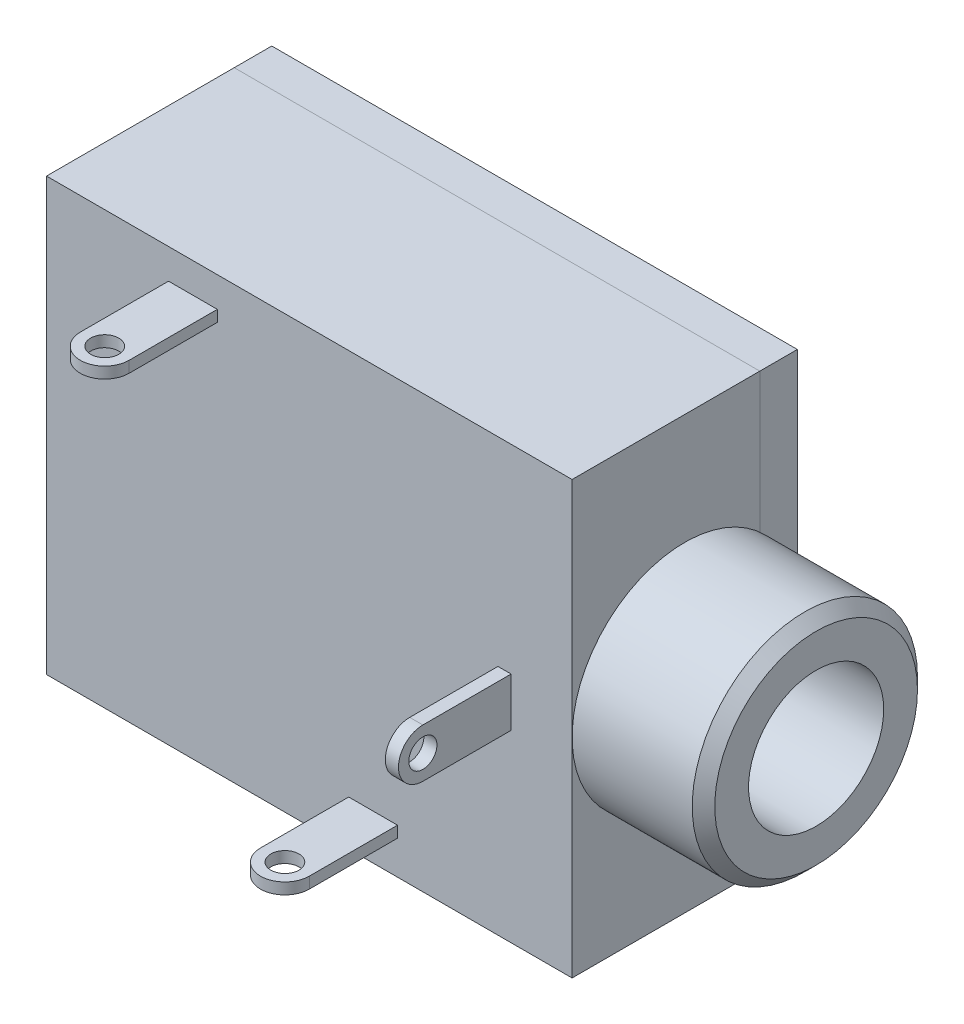
ISO-10303-21;
HEADER;
FILE_DESCRIPTION(('STEP AP214'),'2;1');
FILE_NAME('part.step','',(''),(''),'','','');
FILE_SCHEMA(('AUTOMOTIVE_DESIGN { 1 0 10303 214 1 1 1 1 }'));
ENDSEC;
DATA;
#1=APPLICATION_CONTEXT('core data for automotive mechanical design processes');
#2=APPLICATION_PROTOCOL_DEFINITION('international standard','automotive_design',2000,#1);
#3=PRODUCT_CONTEXT('',#1,'mechanical');
#4=PRODUCT('Part','Part','',(#3));
#5=PRODUCT_RELATED_PRODUCT_CATEGORY('part','',(#4));
#6=PRODUCT_DEFINITION_FORMATION('','',#4);
#7=PRODUCT_DEFINITION_CONTEXT('part definition',#1,'design');
#8=PRODUCT_DEFINITION('design','',#6,#7);
#9=PRODUCT_DEFINITION_SHAPE('','',#8);
#10=(LENGTH_UNIT() NAMED_UNIT(*) SI_UNIT(.MILLI.,.METRE.));
#11=(NAMED_UNIT(*) PLANE_ANGLE_UNIT() SI_UNIT($,.RADIAN.));
#12=(NAMED_UNIT(*) SI_UNIT($,.STERADIAN.) SOLID_ANGLE_UNIT());
#13=UNCERTAINTY_MEASURE_WITH_UNIT(LENGTH_MEASURE(1.E-05),#10,'distance_accuracy_value','');
#14=(GEOMETRIC_REPRESENTATION_CONTEXT(3) GLOBAL_UNCERTAINTY_ASSIGNED_CONTEXT((#13)) GLOBAL_UNIT_ASSIGNED_CONTEXT((#10,
#11,#12)) REPRESENTATION_CONTEXT('',''));
#15=CARTESIAN_POINT('',(0.,0.,0.));
#16=DIRECTION('',(0.,0.,1.));
#17=DIRECTION('',(1.,0.,0.));
#18=AXIS2_PLACEMENT_3D('',#15,#16,#17);
#19=CARTESIAN_POINT('',(-8.8,-4.65,5.35));
#20=DIRECTION('',(0.,1.,0.));
#21=DIRECTION('',(0.,0.,1.));
#22=AXIS2_PLACEMENT_3D('',#19,#20,#21);
#23=CYLINDRICAL_SURFACE('',#22,0.65);
#24=CARTESIAN_POINT('',(-8.8,-4.35,5.35));
#25=DIRECTION('',(0.,1.,0.));
#26=DIRECTION('',(0.,0.,1.));
#27=AXIS2_PLACEMENT_3D('',#24,#25,#26);
#28=CIRCLE('',#27,0.65);
#29=CARTESIAN_POINT('',(-9.45,-4.35,5.35));
#30=VERTEX_POINT('',#29);
#31=CARTESIAN_POINT('',(-8.15,-4.35,5.35));
#32=VERTEX_POINT('',#31);
#33=EDGE_CURVE('E112',#30,#32,#28,.T.);
#34=ORIENTED_EDGE('',*,*,#33,.F.);
#35=DIRECTION('',(0.,1.,0.));
#36=VECTOR('',#35,1.);
#37=CARTESIAN_POINT('',(-9.45,-4.65,5.35));
#38=LINE('',#37,#36);
#39=CARTESIAN_POINT('',(-9.45,-4.65,5.35));
#40=VERTEX_POINT('',#39);
#41=EDGE_CURVE('E12',#40,#30,#38,.T.);
#42=ORIENTED_EDGE('',*,*,#41,.F.);
#43=CARTESIAN_POINT('',(-8.8,-4.65,5.35));
#44=DIRECTION('',(0.,1.,0.));
#45=DIRECTION('',(0.,0.,1.));
#46=AXIS2_PLACEMENT_3D('',#43,#44,#45);
#47=CIRCLE('',#46,0.65);
#48=CARTESIAN_POINT('',(-8.15,-4.65,5.35));
#49=VERTEX_POINT('',#48);
#50=EDGE_CURVE('E105',#40,#49,#47,.T.);
#51=ORIENTED_EDGE('',*,*,#50,.T.);
#52=DIRECTION('',(0.,1.,0.));
#53=VECTOR('',#52,1.);
#54=CARTESIAN_POINT('',(-8.15,-4.65,5.35));
#55=LINE('',#54,#53);
#56=EDGE_CURVE('E50',#49,#32,#55,.T.);
#57=ORIENTED_EDGE('',*,*,#56,.T.);
#58=EDGE_LOOP('',(#34,#42,#51,#57));
#59=FACE_BOUND('',#58,.T.);
#60=ADVANCED_FACE('F47',(#59),#23,.T.);
#61=CARTESIAN_POINT('',(-9.45,-4.65,3.));
#62=DIRECTION('',(-1.,0.,0.));
#63=DIRECTION('',(0.,0.,1.));
#64=AXIS2_PLACEMENT_3D('',#61,#62,#63);
#65=PLANE('',#64);
#66=DIRECTION('',(0.,0.,1.));
#67=VECTOR('',#66,1.);
#68=CARTESIAN_POINT('',(-9.45,-4.35,3.));
#69=LINE('',#68,#67);
#70=CARTESIAN_POINT('',(-9.45,-4.35,3.));
#71=VERTEX_POINT('',#70);
#72=EDGE_CURVE('E107',#71,#30,#69,.T.);
#73=ORIENTED_EDGE('',*,*,#72,.F.);
#74=DIRECTION('',(0.,1.,0.));
#75=VECTOR('',#74,1.);
#76=CARTESIAN_POINT('',(-9.45,-4.65,3.));
#77=LINE('',#76,#75);
#78=CARTESIAN_POINT('',(-9.45,-4.65,3.));
#79=VERTEX_POINT('',#78);
#80=EDGE_CURVE('E56',#79,#71,#77,.T.);
#81=ORIENTED_EDGE('',*,*,#80,.F.);
#82=DIRECTION('',(0.,0.,1.));
#83=VECTOR('',#82,1.);
#84=CARTESIAN_POINT('',(-9.45,-4.65,3.));
#85=LINE('',#84,#83);
#86=EDGE_CURVE('E102',#79,#40,#85,.T.);
#87=ORIENTED_EDGE('',*,*,#86,.T.);
#88=ORIENTED_EDGE('',*,*,#41,.T.);
#89=EDGE_LOOP('',(#73,#81,#87,#88));
#90=FACE_BOUND('',#89,.T.);
#91=ADVANCED_FACE('F123',(#90),#65,.T.);
#92=CARTESIAN_POINT('',(-8.15,-4.65,3.));
#93=DIRECTION('',(0.,0.,-1.));
#94=DIRECTION('',(-1.,0.,0.));
#95=AXIS2_PLACEMENT_3D('',#92,#93,#94);
#96=PLANE('',#95);
#97=DIRECTION('',(-1.,0.,0.));
#98=VECTOR('',#97,1.);
#99=CARTESIAN_POINT('',(-8.15,-4.35,3.));
#100=LINE('',#99,#98);
#101=CARTESIAN_POINT('',(-8.15,-4.35,3.));
#102=VERTEX_POINT('',#101);
#103=EDGE_CURVE('E97',#102,#71,#100,.T.);
#104=ORIENTED_EDGE('',*,*,#103,.F.);
#105=DIRECTION('',(0.,1.,0.));
#106=VECTOR('',#105,1.);
#107=CARTESIAN_POINT('',(-8.15,-4.65,3.));
#108=LINE('',#107,#106);
#109=CARTESIAN_POINT('',(-8.15,-4.65,3.));
#110=VERTEX_POINT('',#109);
#111=EDGE_CURVE('E92',#110,#102,#108,.T.);
#112=ORIENTED_EDGE('',*,*,#111,.F.);
#113=DIRECTION('',(-1.,0.,0.));
#114=VECTOR('',#113,1.);
#115=CARTESIAN_POINT('',(-8.15,-4.65,3.));
#116=LINE('',#115,#114);
#117=EDGE_CURVE('E95',#110,#79,#116,.T.);
#118=ORIENTED_EDGE('',*,*,#117,.T.);
#119=ORIENTED_EDGE('',*,*,#80,.T.);
#120=EDGE_LOOP('',(#104,#112,#118,#119));
#121=FACE_BOUND('',#120,.T.);
#122=ADVANCED_FACE('F94',(#121),#96,.T.);
#123=CARTESIAN_POINT('',(-8.15,-4.65,5.35));
#124=DIRECTION('',(1.,0.,0.));
#125=DIRECTION('',(0.,0.,-1.));
#126=AXIS2_PLACEMENT_3D('',#123,#124,#125);
#127=PLANE('',#126);
#128=DIRECTION('',(0.,0.,-1.));
#129=VECTOR('',#128,1.);
#130=CARTESIAN_POINT('',(-8.15,-4.35,5.35));
#131=LINE('',#130,#129);
#132=EDGE_CURVE('E115',#32,#102,#131,.T.);
#133=ORIENTED_EDGE('',*,*,#132,.F.);
#134=ORIENTED_EDGE('',*,*,#56,.F.);
#135=DIRECTION('',(0.,0.,-1.));
#136=VECTOR('',#135,1.);
#137=CARTESIAN_POINT('',(-8.15,-4.65,5.35));
#138=LINE('',#137,#136);
#139=EDGE_CURVE('E101',#49,#110,#138,.T.);
#140=ORIENTED_EDGE('',*,*,#139,.T.);
#141=ORIENTED_EDGE('',*,*,#111,.T.);
#142=EDGE_LOOP('',(#133,#134,#140,#141));
#143=FACE_BOUND('',#142,.T.);
#144=ADVANCED_FACE('F104',(#143),#127,.T.);
#145=CARTESIAN_POINT('',(-8.8,-4.65,5.35));
#146=DIRECTION('',(0.,1.,0.));
#147=DIRECTION('',(0.,0.,1.));
#148=AXIS2_PLACEMENT_3D('',#145,#146,#147);
#149=PLANE('',#148);
#150=CARTESIAN_POINT('',(-8.8,-4.65,5.35));
#151=DIRECTION('',(0.,1.,0.));
#152=DIRECTION('',(0.,0.,1.));
#153=AXIS2_PLACEMENT_3D('',#150,#151,#152);
#154=CIRCLE('',#153,0.37499999999999);
#155=CARTESIAN_POINT('',(-8.8,-4.65,5.72499999999999));
#156=VERTEX_POINT('',#155);
#157=EDGE_CURVE('E116',#156,#156,#154,.T.);
#158=ORIENTED_EDGE('',*,*,#157,.T.);
#159=EDGE_LOOP('',(#158));
#160=FACE_BOUND('',#159,.T.);
#161=ORIENTED_EDGE('',*,*,#50,.F.);
#162=ORIENTED_EDGE('',*,*,#86,.F.);
#163=ORIENTED_EDGE('',*,*,#117,.F.);
#164=ORIENTED_EDGE('',*,*,#139,.F.);
#165=EDGE_LOOP('',(#161,#162,#163,#164));
#166=FACE_BOUND('',#165,.T.);
#167=ADVANCED_FACE('F100',(#160,#166),#149,.F.);
#168=CARTESIAN_POINT('',(-8.8,-4.35,5.35));
#169=DIRECTION('',(0.,1.,0.));
#170=DIRECTION('',(0.,0.,1.));
#171=AXIS2_PLACEMENT_3D('',#168,#169,#170);
#172=PLANE('',#171);
#173=CARTESIAN_POINT('',(-8.8,-4.35,5.35));
#174=DIRECTION('',(0.,1.,0.));
#175=DIRECTION('',(0.,0.,1.));
#176=AXIS2_PLACEMENT_3D('',#173,#174,#175);
#177=CIRCLE('',#176,0.37499999999999);
#178=CARTESIAN_POINT('',(-8.8,-4.35,5.72499999999999));
#179=VERTEX_POINT('',#178);
#180=EDGE_CURVE('E152',#179,#179,#177,.T.);
#181=ORIENTED_EDGE('',*,*,#180,.F.);
#182=EDGE_LOOP('',(#181));
#183=FACE_BOUND('',#182,.T.);
#184=ORIENTED_EDGE('',*,*,#33,.T.);
#185=ORIENTED_EDGE('',*,*,#132,.T.);
#186=ORIENTED_EDGE('',*,*,#103,.T.);
#187=ORIENTED_EDGE('',*,*,#72,.T.);
#188=EDGE_LOOP('',(#184,#185,#186,#187));
#189=FACE_BOUND('',#188,.T.);
#190=ADVANCED_FACE('F122',(#183,#189),#172,.T.);
#191=CARTESIAN_POINT('',(-8.8,-4.35,5.35));
#192=DIRECTION('',(0.,1.,0.));
#193=DIRECTION('',(0.,0.,1.));
#194=AXIS2_PLACEMENT_3D('',#191,#192,#193);
#195=CYLINDRICAL_SURFACE('',#194,0.37499999999999);
#196=ORIENTED_EDGE('',*,*,#180,.T.);
#197=EDGE_LOOP('',(#196));
#198=FACE_BOUND('',#197,.T.);
#199=ORIENTED_EDGE('',*,*,#157,.F.);
#200=EDGE_LOOP('',(#199));
#201=FACE_BOUND('',#200,.T.);
#202=ADVANCED_FACE('F141',(#198,#201),#195,.F.);
#203=CLOSED_SHELL('',(#60,#91,#122,#144,#167,#190,#202));
#204=MANIFOLD_SOLID_BREP('B2',#203);
#205=CARTESIAN_POINT('',(-5.125,0.,5.35));
#206=DIRECTION('',(-1.,0.,0.));
#207=DIRECTION('',(0.,0.,1.));
#208=AXIS2_PLACEMENT_3D('',#205,#206,#207);
#209=CYLINDRICAL_SURFACE('',#208,0.65);
#210=CARTESIAN_POINT('',(-5.475,0.,5.35));
#211=DIRECTION('',(-1.,0.,0.));
#212=DIRECTION('',(0.,0.,1.));
#213=AXIS2_PLACEMENT_3D('',#210,#211,#212);
#214=CIRCLE('',#213,0.65);
#215=CARTESIAN_POINT('',(-5.475,-0.65,5.35));
#216=VERTEX_POINT('',#215);
#217=CARTESIAN_POINT('',(-5.475,0.65,5.35));
#218=VERTEX_POINT('',#217);
#219=EDGE_CURVE('E266',#216,#218,#214,.T.);
#220=ORIENTED_EDGE('',*,*,#219,.F.);
#221=DIRECTION('',(-1.,0.,0.));
#222=VECTOR('',#221,1.);
#223=CARTESIAN_POINT('',(-5.125,-0.65,5.35));
#224=LINE('',#223,#222);
#225=CARTESIAN_POINT('',(-5.125,-0.65,5.35));
#226=VERTEX_POINT('',#225);
#227=EDGE_CURVE('E45',#226,#216,#224,.T.);
#228=ORIENTED_EDGE('',*,*,#227,.F.);
#229=CARTESIAN_POINT('',(-5.125,0.,5.35));
#230=DIRECTION('',(-1.,0.,0.));
#231=DIRECTION('',(0.,0.,1.));
#232=AXIS2_PLACEMENT_3D('',#229,#230,#231);
#233=CIRCLE('',#232,0.65);
#234=CARTESIAN_POINT('',(-5.125,0.65,5.35));
#235=VERTEX_POINT('',#234);
#236=EDGE_CURVE('E259',#226,#235,#233,.T.);
#237=ORIENTED_EDGE('',*,*,#236,.T.);
#238=DIRECTION('',(-1.,0.,0.));
#239=VECTOR('',#238,1.);
#240=CARTESIAN_POINT('',(-5.125,0.65,5.35));
#241=LINE('',#240,#239);
#242=EDGE_CURVE('E204',#235,#218,#241,.T.);
#243=ORIENTED_EDGE('',*,*,#242,.T.);
#244=EDGE_LOOP('',(#220,#228,#237,#243));
#245=FACE_BOUND('',#244,.T.);
#246=ADVANCED_FACE('F201',(#245),#209,.T.);
#247=CARTESIAN_POINT('',(-5.125,-0.65,3.));
#248=DIRECTION('',(0.,-1.,0.));
#249=DIRECTION('',(0.,0.,-1.));
#250=AXIS2_PLACEMENT_3D('',#247,#248,#249);
#251=PLANE('',#250);
#252=DIRECTION('',(0.,0.,1.));
#253=VECTOR('',#252,1.);
#254=CARTESIAN_POINT('',(-5.475,-0.65,3.));
#255=LINE('',#254,#253);
#256=CARTESIAN_POINT('',(-5.475,-0.65,3.));
#257=VERTEX_POINT('',#256);
#258=EDGE_CURVE('E261',#257,#216,#255,.T.);
#259=ORIENTED_EDGE('',*,*,#258,.F.);
#260=DIRECTION('',(-1.,0.,0.));
#261=VECTOR('',#260,1.);
#262=CARTESIAN_POINT('',(-5.125,-0.65,3.));
#263=LINE('',#262,#261);
#264=CARTESIAN_POINT('',(-5.125,-0.65,3.));
#265=VERTEX_POINT('',#264);
#266=EDGE_CURVE('E210',#265,#257,#263,.T.);
#267=ORIENTED_EDGE('',*,*,#266,.F.);
#268=DIRECTION('',(0.,0.,1.));
#269=VECTOR('',#268,1.);
#270=CARTESIAN_POINT('',(-5.125,-0.65,3.));
#271=LINE('',#270,#269);
#272=EDGE_CURVE('E256',#265,#226,#271,.T.);
#273=ORIENTED_EDGE('',*,*,#272,.T.);
#274=ORIENTED_EDGE('',*,*,#227,.T.);
#275=EDGE_LOOP('',(#259,#267,#273,#274));
#276=FACE_BOUND('',#275,.T.);
#277=ADVANCED_FACE('F277',(#276),#251,.T.);
#278=CARTESIAN_POINT('',(-5.125,0.65,3.));
#279=DIRECTION('',(0.,0.,-1.));
#280=DIRECTION('',(-1.,0.,0.));
#281=AXIS2_PLACEMENT_3D('',#278,#279,#280);
#282=PLANE('',#281);
#283=DIRECTION('',(0.,-1.,0.));
#284=VECTOR('',#283,1.);
#285=CARTESIAN_POINT('',(-5.475,0.65,3.));
#286=LINE('',#285,#284);
#287=CARTESIAN_POINT('',(-5.475,0.65,3.));
#288=VERTEX_POINT('',#287);
#289=EDGE_CURVE('E251',#288,#257,#286,.T.);
#290=ORIENTED_EDGE('',*,*,#289,.F.);
#291=DIRECTION('',(-1.,0.,0.));
#292=VECTOR('',#291,1.);
#293=CARTESIAN_POINT('',(-5.125,0.65,3.));
#294=LINE('',#293,#292);
#295=CARTESIAN_POINT('',(-5.125,0.65,3.));
#296=VERTEX_POINT('',#295);
#297=EDGE_CURVE('E246',#296,#288,#294,.T.);
#298=ORIENTED_EDGE('',*,*,#297,.F.);
#299=DIRECTION('',(0.,-1.,0.));
#300=VECTOR('',#299,1.);
#301=CARTESIAN_POINT('',(-5.125,0.65,3.));
#302=LINE('',#301,#300);
#303=EDGE_CURVE('E249',#296,#265,#302,.T.);
#304=ORIENTED_EDGE('',*,*,#303,.T.);
#305=ORIENTED_EDGE('',*,*,#266,.T.);
#306=EDGE_LOOP('',(#290,#298,#304,#305));
#307=FACE_BOUND('',#306,.T.);
#308=ADVANCED_FACE('F248',(#307),#282,.T.);
#309=CARTESIAN_POINT('',(-5.125,0.65,5.35));
#310=DIRECTION('',(0.,1.,0.));
#311=DIRECTION('',(0.,0.,1.));
#312=AXIS2_PLACEMENT_3D('',#309,#310,#311);
#313=PLANE('',#312);
#314=DIRECTION('',(0.,0.,-1.));
#315=VECTOR('',#314,1.);
#316=CARTESIAN_POINT('',(-5.475,0.65,5.35));
#317=LINE('',#316,#315);
#318=EDGE_CURVE('E269',#218,#288,#317,.T.);
#319=ORIENTED_EDGE('',*,*,#318,.F.);
#320=ORIENTED_EDGE('',*,*,#242,.F.);
#321=DIRECTION('',(0.,0.,-1.));
#322=VECTOR('',#321,1.);
#323=CARTESIAN_POINT('',(-5.125,0.65,5.35));
#324=LINE('',#323,#322);
#325=EDGE_CURVE('E255',#235,#296,#324,.T.);
#326=ORIENTED_EDGE('',*,*,#325,.T.);
#327=ORIENTED_EDGE('',*,*,#297,.T.);
#328=EDGE_LOOP('',(#319,#320,#326,#327));
#329=FACE_BOUND('',#328,.T.);
#330=ADVANCED_FACE('F258',(#329),#313,.T.);
#331=CARTESIAN_POINT('',(-5.125,0.,5.35));
#332=DIRECTION('',(-1.,0.,0.));
#333=DIRECTION('',(0.,0.,1.));
#334=AXIS2_PLACEMENT_3D('',#331,#332,#333);
#335=PLANE('',#334);
#336=CARTESIAN_POINT('',(-5.125,0.,5.35));
#337=DIRECTION('',(-1.,0.,0.));
#338=DIRECTION('',(0.,0.,1.));
#339=AXIS2_PLACEMENT_3D('',#336,#337,#338);
#340=CIRCLE('',#339,0.374999999999989);
#341=CARTESIAN_POINT('',(-5.125,0.,5.72499999999999));
#342=VERTEX_POINT('',#341);
#343=EDGE_CURVE('E270',#342,#342,#340,.T.);
#344=ORIENTED_EDGE('',*,*,#343,.T.);
#345=EDGE_LOOP('',(#344));
#346=FACE_BOUND('',#345,.T.);
#347=ORIENTED_EDGE('',*,*,#236,.F.);
#348=ORIENTED_EDGE('',*,*,#272,.F.);
#349=ORIENTED_EDGE('',*,*,#303,.F.);
#350=ORIENTED_EDGE('',*,*,#325,.F.);
#351=EDGE_LOOP('',(#347,#348,#349,#350));
#352=FACE_BOUND('',#351,.T.);
#353=ADVANCED_FACE('F254',(#346,#352),#335,.F.);
#354=CARTESIAN_POINT('',(-5.475,0.,5.35));
#355=DIRECTION('',(-1.,0.,0.));
#356=DIRECTION('',(0.,0.,1.));
#357=AXIS2_PLACEMENT_3D('',#354,#355,#356);
#358=PLANE('',#357);
#359=CARTESIAN_POINT('',(-5.475,0.,5.35));
#360=DIRECTION('',(-1.,0.,0.));
#361=DIRECTION('',(0.,0.,1.));
#362=AXIS2_PLACEMENT_3D('',#359,#360,#361);
#363=CIRCLE('',#362,0.37499999999999);
#364=CARTESIAN_POINT('',(-5.475,0.,5.72499999999999));
#365=VERTEX_POINT('',#364);
#366=EDGE_CURVE('E306',#365,#365,#363,.T.);
#367=ORIENTED_EDGE('',*,*,#366,.F.);
#368=EDGE_LOOP('',(#367));
#369=FACE_BOUND('',#368,.T.);
#370=ORIENTED_EDGE('',*,*,#219,.T.);
#371=ORIENTED_EDGE('',*,*,#318,.T.);
#372=ORIENTED_EDGE('',*,*,#289,.T.);
#373=ORIENTED_EDGE('',*,*,#258,.T.);
#374=EDGE_LOOP('',(#370,#371,#372,#373));
#375=FACE_BOUND('',#374,.T.);
#376=ADVANCED_FACE('F276',(#369,#375),#358,.T.);
#377=CARTESIAN_POINT('',(-5.475,0.,5.35));
#378=DIRECTION('',(-1.,0.,0.));
#379=DIRECTION('',(0.,0.,1.));
#380=AXIS2_PLACEMENT_3D('',#377,#378,#379);
#381=CYLINDRICAL_SURFACE('',#380,0.374999999999989);
#382=ORIENTED_EDGE('',*,*,#366,.T.);
#383=EDGE_LOOP('',(#382));
#384=FACE_BOUND('',#383,.T.);
#385=ORIENTED_EDGE('',*,*,#343,.F.);
#386=EDGE_LOOP('',(#385));
#387=FACE_BOUND('',#386,.T.);
#388=ADVANCED_FACE('F295',(#384,#387),#381,.F.);
#389=CLOSED_SHELL('',(#246,#277,#308,#330,#353,#376,#388));
#390=MANIFOLD_SOLID_BREP('B6',#389);
#391=CARTESIAN_POINT('',(-13.6,4.85,5.35));
#392=DIRECTION('',(0.,1.,0.));
#393=DIRECTION('',(0.,0.,1.));
#394=AXIS2_PLACEMENT_3D('',#391,#392,#393);
#395=CYLINDRICAL_SURFACE('',#394,0.65);
#396=CARTESIAN_POINT('',(-13.6,5.15,5.35));
#397=DIRECTION('',(0.,1.,0.));
#398=DIRECTION('',(0.,0.,1.));
#399=AXIS2_PLACEMENT_3D('',#396,#397,#398);
#400=CIRCLE('',#399,0.65);
#401=CARTESIAN_POINT('',(-14.25,5.15,5.35));
#402=VERTEX_POINT('',#401);
#403=CARTESIAN_POINT('',(-12.95,5.15,5.35));
#404=VERTEX_POINT('',#403);
#405=EDGE_CURVE('E420',#402,#404,#400,.T.);
#406=ORIENTED_EDGE('',*,*,#405,.F.);
#407=DIRECTION('',(0.,1.,0.));
#408=VECTOR('',#407,1.);
#409=CARTESIAN_POINT('',(-14.25,4.85,5.35));
#410=LINE('',#409,#408);
#411=CARTESIAN_POINT('',(-14.25,4.85,5.35));
#412=VERTEX_POINT('',#411);
#413=EDGE_CURVE('E199',#412,#402,#410,.T.);
#414=ORIENTED_EDGE('',*,*,#413,.F.);
#415=CARTESIAN_POINT('',(-13.6,4.85,5.35));
#416=DIRECTION('',(0.,1.,0.));
#417=DIRECTION('',(0.,0.,1.));
#418=AXIS2_PLACEMENT_3D('',#415,#416,#417);
#419=CIRCLE('',#418,0.65);
#420=CARTESIAN_POINT('',(-12.95,4.85,5.35));
#421=VERTEX_POINT('',#420);
#422=EDGE_CURVE('E413',#412,#421,#419,.T.);
#423=ORIENTED_EDGE('',*,*,#422,.T.);
#424=DIRECTION('',(0.,1.,0.));
#425=VECTOR('',#424,1.);
#426=CARTESIAN_POINT('',(-12.95,4.85,5.35));
#427=LINE('',#426,#425);
#428=EDGE_CURVE('E396',#421,#404,#427,.T.);
#429=ORIENTED_EDGE('',*,*,#428,.T.);
#430=EDGE_LOOP('',(#406,#414,#423,#429));
#431=FACE_BOUND('',#430,.T.);
#432=ADVANCED_FACE('F353',(#431),#395,.T.);
#433=CARTESIAN_POINT('',(-14.25,4.85,3.));
#434=DIRECTION('',(-1.,0.,0.));
#435=DIRECTION('',(0.,0.,1.));
#436=AXIS2_PLACEMENT_3D('',#433,#434,#435);
#437=PLANE('',#436);
#438=DIRECTION('',(0.,0.,1.));
#439=VECTOR('',#438,1.);
#440=CARTESIAN_POINT('',(-14.25,5.15,3.));
#441=LINE('',#440,#439);
#442=CARTESIAN_POINT('',(-14.25,5.15,3.));
#443=VERTEX_POINT('',#442);
#444=EDGE_CURVE('E415',#443,#402,#441,.T.);
#445=ORIENTED_EDGE('',*,*,#444,.F.);
#446=DIRECTION('',(0.,1.,0.));
#447=VECTOR('',#446,1.);
#448=CARTESIAN_POINT('',(-14.25,4.85,3.));
#449=LINE('',#448,#447);
#450=CARTESIAN_POINT('',(-14.25,4.85,3.));
#451=VERTEX_POINT('',#450);
#452=EDGE_CURVE('E362',#451,#443,#449,.T.);
#453=ORIENTED_EDGE('',*,*,#452,.F.);
#454=DIRECTION('',(0.,0.,1.));
#455=VECTOR('',#454,1.);
#456=CARTESIAN_POINT('',(-14.25,4.85,3.));
#457=LINE('',#456,#455);
#458=EDGE_CURVE('E410',#451,#412,#457,.T.);
#459=ORIENTED_EDGE('',*,*,#458,.T.);
#460=ORIENTED_EDGE('',*,*,#413,.T.);
#461=EDGE_LOOP('',(#445,#453,#459,#460));
#462=FACE_BOUND('',#461,.T.);
#463=ADVANCED_FACE('F430',(#462),#437,.T.);
#464=CARTESIAN_POINT('',(-12.95,4.85,3.));
#465=DIRECTION('',(0.,0.,-1.));
#466=DIRECTION('',(-1.,0.,0.));
#467=AXIS2_PLACEMENT_3D('',#464,#465,#466);
#468=PLANE('',#467);
#469=DIRECTION('',(-1.,0.,0.));
#470=VECTOR('',#469,1.);
#471=CARTESIAN_POINT('',(-12.95,5.15,3.));
#472=LINE('',#471,#470);
#473=CARTESIAN_POINT('',(-12.95,5.15,3.));
#474=VERTEX_POINT('',#473);
#475=EDGE_CURVE('E404',#474,#443,#472,.T.);
#476=ORIENTED_EDGE('',*,*,#475,.F.);
#477=DIRECTION('',(0.,1.,0.));
#478=VECTOR('',#477,1.);
#479=CARTESIAN_POINT('',(-12.95,4.85,3.));
#480=LINE('',#479,#478);
#481=CARTESIAN_POINT('',(-12.95,4.85,3.));
#482=VERTEX_POINT('',#481);
#483=EDGE_CURVE('E399',#482,#474,#480,.T.);
#484=ORIENTED_EDGE('',*,*,#483,.F.);
#485=DIRECTION('',(-1.,0.,0.));
#486=VECTOR('',#485,1.);
#487=CARTESIAN_POINT('',(-12.95,4.85,3.));
#488=LINE('',#487,#486);
#489=EDGE_CURVE('E402',#482,#451,#488,.T.);
#490=ORIENTED_EDGE('',*,*,#489,.T.);
#491=ORIENTED_EDGE('',*,*,#452,.T.);
#492=EDGE_LOOP('',(#476,#484,#490,#491));
#493=FACE_BOUND('',#492,.T.);
#494=ADVANCED_FACE('F401',(#493),#468,.T.);
#495=CARTESIAN_POINT('',(-12.95,4.85,5.35));
#496=DIRECTION('',(1.,0.,0.));
#497=DIRECTION('',(0.,0.,-1.));
#498=AXIS2_PLACEMENT_3D('',#495,#496,#497);
#499=PLANE('',#498);
#500=DIRECTION('',(0.,0.,-1.));
#501=VECTOR('',#500,1.);
#502=CARTESIAN_POINT('',(-12.95,5.15,5.35));
#503=LINE('',#502,#501);
#504=EDGE_CURVE('E423',#404,#474,#503,.T.);
#505=ORIENTED_EDGE('',*,*,#504,.F.);
#506=ORIENTED_EDGE('',*,*,#428,.F.);
#507=DIRECTION('',(0.,0.,-1.));
#508=VECTOR('',#507,1.);
#509=CARTESIAN_POINT('',(-12.95,4.85,5.35));
#510=LINE('',#509,#508);
#511=EDGE_CURVE('E409',#421,#482,#510,.T.);
#512=ORIENTED_EDGE('',*,*,#511,.T.);
#513=ORIENTED_EDGE('',*,*,#483,.T.);
#514=EDGE_LOOP('',(#505,#506,#512,#513));
#515=FACE_BOUND('',#514,.T.);
#516=ADVANCED_FACE('F412',(#515),#499,.T.);
#517=CARTESIAN_POINT('',(-13.6,4.85,5.35));
#518=DIRECTION('',(0.,1.,0.));
#519=DIRECTION('',(0.,0.,1.));
#520=AXIS2_PLACEMENT_3D('',#517,#518,#519);
#521=PLANE('',#520);
#522=CARTESIAN_POINT('',(-13.6,4.85,5.35));
#523=DIRECTION('',(0.,-1.,0.));
#524=DIRECTION('',(0.,0.,-1.));
#525=AXIS2_PLACEMENT_3D('',#522,#523,#524);
#526=CIRCLE('',#525,0.374999999999988);
#527=CARTESIAN_POINT('',(-13.6,4.85,4.97500000000001));
#528=VERTEX_POINT('',#527);
#529=EDGE_CURVE('E460',#528,#528,#526,.T.);
#530=ORIENTED_EDGE('',*,*,#529,.F.);
#531=EDGE_LOOP('',(#530));
#532=FACE_BOUND('',#531,.T.);
#533=ORIENTED_EDGE('',*,*,#422,.F.);
#534=ORIENTED_EDGE('',*,*,#458,.F.);
#535=ORIENTED_EDGE('',*,*,#489,.F.);
#536=ORIENTED_EDGE('',*,*,#511,.F.);
#537=EDGE_LOOP('',(#533,#534,#535,#536));
#538=FACE_BOUND('',#537,.T.);
#539=ADVANCED_FACE('F408',(#532,#538),#521,.F.);
#540=CARTESIAN_POINT('',(-13.6,5.15,5.35));
#541=DIRECTION('',(0.,1.,0.));
#542=DIRECTION('',(0.,0.,1.));
#543=AXIS2_PLACEMENT_3D('',#540,#541,#542);
#544=PLANE('',#543);
#545=CARTESIAN_POINT('',(-13.6,5.15,5.35));
#546=DIRECTION('',(0.,1.,0.));
#547=DIRECTION('',(0.,0.,1.));
#548=AXIS2_PLACEMENT_3D('',#545,#546,#547);
#549=CIRCLE('',#548,0.374999999999988);
#550=CARTESIAN_POINT('',(-13.6,5.15,5.72499999999999));
#551=VERTEX_POINT('',#550);
#552=EDGE_CURVE('E356',#551,#551,#549,.T.);
#553=ORIENTED_EDGE('',*,*,#552,.F.);
#554=EDGE_LOOP('',(#553));
#555=FACE_BOUND('',#554,.T.);
#556=ORIENTED_EDGE('',*,*,#405,.T.);
#557=ORIENTED_EDGE('',*,*,#504,.T.);
#558=ORIENTED_EDGE('',*,*,#475,.T.);
#559=ORIENTED_EDGE('',*,*,#444,.T.);
#560=EDGE_LOOP('',(#556,#557,#558,#559));
#561=FACE_BOUND('',#560,.T.);
#562=ADVANCED_FACE('F429',(#555,#561),#544,.T.);
#563=CARTESIAN_POINT('',(-13.6,4.85,5.35));
#564=DIRECTION('',(0.,-1.,0.));
#565=DIRECTION('',(0.,0.,-1.));
#566=AXIS2_PLACEMENT_3D('',#563,#564,#565);
#567=CYLINDRICAL_SURFACE('',#566,0.374999999999988);
#568=ORIENTED_EDGE('',*,*,#552,.T.);
#569=EDGE_LOOP('',(#568));
#570=FACE_BOUND('',#569,.T.);
#571=ORIENTED_EDGE('',*,*,#529,.T.);
#572=EDGE_LOOP('',(#571));
#573=FACE_BOUND('',#572,.T.);
#574=ADVANCED_FACE('F448',(#570,#573),#567,.F.);
#575=CLOSED_SHELL('',(#432,#463,#494,#516,#539,#562,#574));
#576=MANIFOLD_SOLID_BREP('B39',#575);
#577=CARTESIAN_POINT('',(0.,0.,0.));
#578=DIRECTION('',(-1.,0.,0.));
#579=DIRECTION('',(0.,0.,1.));
#580=AXIS2_PLACEMENT_3D('',#577,#578,#579);
#581=CYLINDRICAL_SURFACE('',#580,3.);
#582=CARTESIAN_POINT('',(-0.300000000000001,0.,0.));
#583=DIRECTION('',(1.,0.,0.));
#584=DIRECTION('',(0.,0.,-1.));
#585=AXIS2_PLACEMENT_3D('',#582,#583,#584);
#586=CIRCLE('',#585,3.);
#587=CARTESIAN_POINT('',(-0.300000000000001,0.,-3.));
#588=VERTEX_POINT('',#587);
#589=EDGE_CURVE('E352',#588,#588,#586,.F.);
#590=ORIENTED_EDGE('',*,*,#589,.T.);
#591=EDGE_LOOP('',(#590));
#592=FACE_BOUND('',#591,.T.);
#593=CARTESIAN_POINT('',(-3.5,0.,0.));
#594=DIRECTION('',(1.,0.,0.));
#595=DIRECTION('',(0.,0.,-1.));
#596=AXIS2_PLACEMENT_3D('',#593,#594,#595);
#597=CIRCLE('',#596,3.);
#598=CARTESIAN_POINT('',(-3.5,0.,-3.));
#599=VERTEX_POINT('',#598);
#600=EDGE_CURVE('E519',#599,#599,#597,.T.);
#601=ORIENTED_EDGE('',*,*,#600,.T.);
#602=EDGE_LOOP('',(#601));
#603=FACE_BOUND('',#602,.T.);
#604=ADVANCED_FACE('F507',(#592,#603),#581,.T.);
#605=CARTESIAN_POINT('',(0.,0.,0.));
#606=DIRECTION('',(1.,0.,0.));
#607=DIRECTION('',(0.,0.,-1.));
#608=AXIS2_PLACEMENT_3D('',#605,#606,#607);
#609=PLANE('',#608);
#610=CARTESIAN_POINT('',(0.,0.,0.));
#611=DIRECTION('',(1.,0.,0.));
#612=DIRECTION('',(0.,0.,-1.));
#613=AXIS2_PLACEMENT_3D('',#610,#611,#612);
#614=CIRCLE('',#613,2.7);
#615=CARTESIAN_POINT('',(0.,0.,-2.7));
#616=VERTEX_POINT('',#615);
#617=EDGE_CURVE('E515',#616,#616,#614,.T.);
#618=ORIENTED_EDGE('',*,*,#617,.T.);
#619=EDGE_LOOP('',(#618));
#620=FACE_BOUND('',#619,.T.);
#621=CARTESIAN_POINT('',(0.,0.,0.));
#622=DIRECTION('',(1.,0.,0.));
#623=DIRECTION('',(0.,0.,-1.));
#624=AXIS2_PLACEMENT_3D('',#621,#622,#623);
#625=CIRCLE('',#624,1.79999999999999);
#626=CARTESIAN_POINT('',(0.,0.,-1.79999999999999));
#627=VERTEX_POINT('',#626);
#628=EDGE_CURVE('E528',#627,#627,#625,.T.);
#629=ORIENTED_EDGE('',*,*,#628,.F.);
#630=EDGE_LOOP('',(#629));
#631=FACE_BOUND('',#630,.T.);
#632=ADVANCED_FACE('F534',(#620,#631),#609,.T.);
#633=CARTESIAN_POINT('',(-3.5,0.,0.));
#634=DIRECTION('',(1.,0.,0.));
#635=DIRECTION('',(0.,0.,-1.));
#636=AXIS2_PLACEMENT_3D('',#633,#634,#635);
#637=PLANE('',#636);
#638=CARTESIAN_POINT('',(-3.5,0.,0.));
#639=DIRECTION('',(1.,0.,0.));
#640=DIRECTION('',(0.,0.,-1.));
#641=AXIS2_PLACEMENT_3D('',#638,#639,#640);
#642=CIRCLE('',#641,1.79999999999999);
#643=CARTESIAN_POINT('',(-3.5,0.,-1.79999999999999));
#644=VERTEX_POINT('',#643);
#645=EDGE_CURVE('E523',#644,#644,#642,.T.);
#646=ORIENTED_EDGE('',*,*,#645,.T.);
#647=EDGE_LOOP('',(#646));
#648=FACE_BOUND('',#647,.T.);
#649=ORIENTED_EDGE('',*,*,#600,.F.);
#650=EDGE_LOOP('',(#649));
#651=FACE_BOUND('',#650,.T.);
#652=ADVANCED_FACE('F536',(#648,#651),#637,.F.);
#653=CARTESIAN_POINT('',(0.,0.,0.));
#654=DIRECTION('',(1.,0.,0.));
#655=DIRECTION('',(0.,0.,-1.));
#656=AXIS2_PLACEMENT_3D('',#653,#654,#655);
#657=CYLINDRICAL_SURFACE('',#656,1.79999999999999);
#658=ORIENTED_EDGE('',*,*,#645,.F.);
#659=EDGE_LOOP('',(#658));
#660=FACE_BOUND('',#659,.T.);
#661=ORIENTED_EDGE('',*,*,#628,.T.);
#662=EDGE_LOOP('',(#661));
#663=FACE_BOUND('',#662,.T.);
#664=ADVANCED_FACE('F532',(#660,#663),#657,.F.);
#665=CARTESIAN_POINT('',(0.,0.,0.));
#666=DIRECTION('',(-1.,0.,0.));
#667=DIRECTION('',(0.,0.,1.));
#668=AXIS2_PLACEMENT_3D('',#665,#666,#667);
#669=CONICAL_SURFACE('',#668,2.7,0.785398163397444);
#670=ORIENTED_EDGE('',*,*,#589,.F.);
#671=EDGE_LOOP('',(#670));
#672=FACE_BOUND('',#671,.T.);
#673=ORIENTED_EDGE('',*,*,#617,.F.);
#674=EDGE_LOOP('',(#673));
#675=FACE_BOUND('',#674,.T.);
#676=ADVANCED_FACE('F510',(#672,#675),#669,.T.);
#677=CLOSED_SHELL('',(#604,#632,#652,#664,#676));
#678=MANIFOLD_SOLID_BREP('B193',#677);
#679=CARTESIAN_POINT('',(-3.5,5.95,-2.));
#680=DIRECTION('',(0.,1.,0.));
#681=DIRECTION('',(0.,0.,1.));
#682=AXIS2_PLACEMENT_3D('',#679,#680,#681);
#683=PLANE('',#682);
#684=DIRECTION('',(-1.,0.,0.));
#685=VECTOR('',#684,1.);
#686=CARTESIAN_POINT('',(-3.5,5.95,3.));
#687=LINE('',#686,#685);
#688=CARTESIAN_POINT('',(-3.5,5.95,3.));
#689=VERTEX_POINT('',#688);
#690=CARTESIAN_POINT('',(-17.5,5.95,3.));
#691=VERTEX_POINT('',#690);
#692=EDGE_CURVE('E659',#689,#691,#687,.T.);
#693=ORIENTED_EDGE('',*,*,#692,.F.);
#694=DIRECTION('',(0.,0.,1.));
#695=VECTOR('',#694,1.);
#696=CARTESIAN_POINT('',(-3.5,5.95,-2.));
#697=LINE('',#696,#695);
#698=CARTESIAN_POINT('',(-3.5,5.95,-2.));
#699=VERTEX_POINT('',#698);
#700=EDGE_CURVE('E505',#699,#689,#697,.T.);
#701=ORIENTED_EDGE('',*,*,#700,.F.);
#702=DIRECTION('',(-1.,0.,0.));
#703=VECTOR('',#702,1.);
#704=CARTESIAN_POINT('',(-3.5,5.95,-2.));
#705=LINE('',#704,#703);
#706=CARTESIAN_POINT('',(-17.5,5.95,-2.));
#707=VERTEX_POINT('',#706);
#708=EDGE_CURVE('E653',#699,#707,#705,.T.);
#709=ORIENTED_EDGE('',*,*,#708,.T.);
#710=DIRECTION('',(0.,0.,1.));
#711=VECTOR('',#710,1.);
#712=CARTESIAN_POINT('',(-17.5,5.95,-2.));
#713=LINE('',#712,#711);
#714=EDGE_CURVE('E598',#707,#691,#713,.T.);
#715=ORIENTED_EDGE('',*,*,#714,.T.);
#716=EDGE_LOOP('',(#693,#701,#709,#715));
#717=FACE_BOUND('',#716,.T.);
#718=ADVANCED_FACE('F595',(#717),#683,.T.);
#719=CARTESIAN_POINT('',(-3.5,-5.55,-2.));
#720=DIRECTION('',(1.,0.,0.));
#721=DIRECTION('',(0.,0.,-1.));
#722=AXIS2_PLACEMENT_3D('',#719,#720,#721);
#723=PLANE('',#722);
#724=DIRECTION('',(0.,1.,0.));
#725=VECTOR('',#724,1.);
#726=CARTESIAN_POINT('',(-3.5,-5.55,3.));
#727=LINE('',#726,#725);
#728=CARTESIAN_POINT('',(-3.5,-5.55,3.));
#729=VERTEX_POINT('',#728);
#730=EDGE_CURVE('E655',#729,#689,#727,.T.);
#731=ORIENTED_EDGE('',*,*,#730,.F.);
#732=DIRECTION('',(0.,0.,1.));
#733=VECTOR('',#732,1.);
#734=CARTESIAN_POINT('',(-3.5,-5.55,-2.));
#735=LINE('',#734,#733);
#736=CARTESIAN_POINT('',(-3.5,-5.55,-2.));
#737=VERTEX_POINT('',#736);
#738=EDGE_CURVE('E604',#737,#729,#735,.T.);
#739=ORIENTED_EDGE('',*,*,#738,.F.);
#740=DIRECTION('',(0.,1.,0.));
#741=VECTOR('',#740,1.);
#742=CARTESIAN_POINT('',(-3.5,-5.55,-2.));
#743=LINE('',#742,#741);
#744=EDGE_CURVE('E650',#737,#699,#743,.T.);
#745=ORIENTED_EDGE('',*,*,#744,.T.);
#746=ORIENTED_EDGE('',*,*,#700,.T.);
#747=EDGE_LOOP('',(#731,#739,#745,#746));
#748=FACE_BOUND('',#747,.T.);
#749=ADVANCED_FACE('F669',(#748),#723,.T.);
#750=CARTESIAN_POINT('',(-17.5,-5.55,-2.));
#751=DIRECTION('',(0.,-1.,0.));
#752=DIRECTION('',(0.,0.,-1.));
#753=AXIS2_PLACEMENT_3D('',#750,#751,#752);
#754=PLANE('',#753);
#755=DIRECTION('',(1.,0.,0.));
#756=VECTOR('',#755,1.);
#757=CARTESIAN_POINT('',(-17.5,-5.55,3.));
#758=LINE('',#757,#756);
#759=CARTESIAN_POINT('',(-17.5,-5.55,3.));
#760=VERTEX_POINT('',#759);
#761=EDGE_CURVE('E645',#760,#729,#758,.T.);
#762=ORIENTED_EDGE('',*,*,#761,.F.);
#763=DIRECTION('',(0.,0.,1.));
#764=VECTOR('',#763,1.);
#765=CARTESIAN_POINT('',(-17.5,-5.55,-2.));
#766=LINE('',#765,#764);
#767=CARTESIAN_POINT('',(-17.5,-5.55,-2.));
#768=VERTEX_POINT('',#767);
#769=EDGE_CURVE('E640',#768,#760,#766,.T.);
#770=ORIENTED_EDGE('',*,*,#769,.F.);
#771=DIRECTION('',(1.,0.,0.));
#772=VECTOR('',#771,1.);
#773=CARTESIAN_POINT('',(-17.5,-5.55,-2.));
#774=LINE('',#773,#772);
#775=EDGE_CURVE('E643',#768,#737,#774,.T.);
#776=ORIENTED_EDGE('',*,*,#775,.T.);
#777=ORIENTED_EDGE('',*,*,#738,.T.);
#778=EDGE_LOOP('',(#762,#770,#776,#777));
#779=FACE_BOUND('',#778,.T.);
#780=ADVANCED_FACE('F642',(#779),#754,.T.);
#781=CARTESIAN_POINT('',(-17.5,5.95,-2.));
#782=DIRECTION('',(-1.,0.,0.));
#783=DIRECTION('',(0.,0.,1.));
#784=AXIS2_PLACEMENT_3D('',#781,#782,#783);
#785=PLANE('',#784);
#786=DIRECTION('',(0.,-1.,0.));
#787=VECTOR('',#786,1.);
#788=CARTESIAN_POINT('',(-17.5,5.95,3.));
#789=LINE('',#788,#787);
#790=EDGE_CURVE('E662',#691,#760,#789,.T.);
#791=ORIENTED_EDGE('',*,*,#790,.F.);
#792=ORIENTED_EDGE('',*,*,#714,.F.);
#793=DIRECTION('',(0.,-1.,0.));
#794=VECTOR('',#793,1.);
#795=CARTESIAN_POINT('',(-17.5,5.95,-2.));
#796=LINE('',#795,#794);
#797=EDGE_CURVE('E649',#707,#768,#796,.T.);
#798=ORIENTED_EDGE('',*,*,#797,.T.);
#799=ORIENTED_EDGE('',*,*,#769,.T.);
#800=EDGE_LOOP('',(#791,#792,#798,#799));
#801=FACE_BOUND('',#800,.T.);
#802=ADVANCED_FACE('F652',(#801),#785,.T.);
#803=CARTESIAN_POINT('',(0.,0.,-2.));
#804=DIRECTION('',(0.,0.,1.));
#805=DIRECTION('',(1.,0.,0.));
#806=AXIS2_PLACEMENT_3D('',#803,#804,#805);
#807=PLANE('',#806);
#808=ORIENTED_EDGE('',*,*,#708,.F.);
#809=ORIENTED_EDGE('',*,*,#744,.F.);
#810=ORIENTED_EDGE('',*,*,#775,.F.);
#811=ORIENTED_EDGE('',*,*,#797,.F.);
#812=EDGE_LOOP('',(#808,#809,#810,#811));
#813=FACE_BOUND('',#812,.T.);
#814=ADVANCED_FACE('F648',(#813),#807,.F.);
#815=CARTESIAN_POINT('',(0.,0.,3.));
#816=DIRECTION('',(0.,0.,1.));
#817=DIRECTION('',(1.,0.,0.));
#818=AXIS2_PLACEMENT_3D('',#815,#816,#817);
#819=PLANE('',#818);
#820=ORIENTED_EDGE('',*,*,#692,.T.);
#821=ORIENTED_EDGE('',*,*,#790,.T.);
#822=ORIENTED_EDGE('',*,*,#761,.T.);
#823=ORIENTED_EDGE('',*,*,#730,.T.);
#824=EDGE_LOOP('',(#820,#821,#822,#823));
#825=FACE_BOUND('',#824,.T.);
#826=ADVANCED_FACE('F668',(#825),#819,.T.);
#827=CLOSED_SHELL('',(#718,#749,#780,#802,#814,#826));
#828=MANIFOLD_SOLID_BREP('B347',#827);
#829=CARTESIAN_POINT('',(-17.5,5.95,-2.));
#830=DIRECTION('',(0.,1.,0.));
#831=DIRECTION('',(0.,0.,1.));
#832=AXIS2_PLACEMENT_3D('',#829,#830,#831);
#833=PLANE('',#832);
#834=DIRECTION('',(1.,0.,0.));
#835=VECTOR('',#834,1.);
#836=CARTESIAN_POINT('',(-17.5,5.95,-3.));
#837=LINE('',#836,#835);
#838=CARTESIAN_POINT('',(-17.5,5.95,-3.));
#839=VERTEX_POINT('',#838);
#840=CARTESIAN_POINT('',(-3.5,5.95,-3.));
#841=VERTEX_POINT('',#840);
#842=EDGE_CURVE('E782',#839,#841,#837,.T.);
#843=ORIENTED_EDGE('',*,*,#842,.F.);
#844=DIRECTION('',(0.,0.,-1.));
#845=VECTOR('',#844,1.);
#846=CARTESIAN_POINT('',(-17.5,5.95,-2.));
#847=LINE('',#846,#845);
#848=CARTESIAN_POINT('',(-17.5,5.95,-2.));
#849=VERTEX_POINT('',#848);
#850=EDGE_CURVE('E593',#849,#839,#847,.T.);
#851=ORIENTED_EDGE('',*,*,#850,.F.);
#852=DIRECTION('',(1.,0.,0.));
#853=VECTOR('',#852,1.);
#854=CARTESIAN_POINT('',(-17.5,5.95,-2.));
#855=LINE('',#854,#853);
#856=CARTESIAN_POINT('',(-3.5,5.95,-2.));
#857=VERTEX_POINT('',#856);
#858=EDGE_CURVE('E776',#849,#857,#855,.T.);
#859=ORIENTED_EDGE('',*,*,#858,.T.);
#860=DIRECTION('',(0.,0.,-1.));
#861=VECTOR('',#860,1.);
#862=CARTESIAN_POINT('',(-3.5,5.95,-2.));
#863=LINE('',#862,#861);
#864=EDGE_CURVE('E721',#857,#841,#863,.T.);
#865=ORIENTED_EDGE('',*,*,#864,.T.);
#866=EDGE_LOOP('',(#843,#851,#859,#865));
#867=FACE_BOUND('',#866,.T.);
#868=ADVANCED_FACE('F718',(#867),#833,.T.);
#869=CARTESIAN_POINT('',(-17.5,-5.55,-2.));
#870=DIRECTION('',(-1.,0.,0.));
#871=DIRECTION('',(0.,0.,1.));
#872=AXIS2_PLACEMENT_3D('',#869,#870,#871);
#873=PLANE('',#872);
#874=DIRECTION('',(0.,1.,0.));
#875=VECTOR('',#874,1.);
#876=CARTESIAN_POINT('',(-17.5,-5.55,-3.));
#877=LINE('',#876,#875);
#878=CARTESIAN_POINT('',(-17.5,-5.55,-3.));
#879=VERTEX_POINT('',#878);
#880=EDGE_CURVE('E778',#879,#839,#877,.T.);
#881=ORIENTED_EDGE('',*,*,#880,.F.);
#882=DIRECTION('',(0.,0.,-1.));
#883=VECTOR('',#882,1.);
#884=CARTESIAN_POINT('',(-17.5,-5.55,-2.));
#885=LINE('',#884,#883);
#886=CARTESIAN_POINT('',(-17.5,-5.55,-2.));
#887=VERTEX_POINT('',#886);
#888=EDGE_CURVE('E727',#887,#879,#885,.T.);
#889=ORIENTED_EDGE('',*,*,#888,.F.);
#890=DIRECTION('',(0.,1.,0.));
#891=VECTOR('',#890,1.);
#892=CARTESIAN_POINT('',(-17.5,-5.55,-2.));
#893=LINE('',#892,#891);
#894=EDGE_CURVE('E773',#887,#849,#893,.T.);
#895=ORIENTED_EDGE('',*,*,#894,.T.);
#896=ORIENTED_EDGE('',*,*,#850,.T.);
#897=EDGE_LOOP('',(#881,#889,#895,#896));
#898=FACE_BOUND('',#897,.T.);
#899=ADVANCED_FACE('F792',(#898),#873,.T.);
#900=CARTESIAN_POINT('',(-3.5,-5.55,-2.));
#901=DIRECTION('',(0.,-1.,0.));
#902=DIRECTION('',(0.,0.,-1.));
#903=AXIS2_PLACEMENT_3D('',#900,#901,#902);
#904=PLANE('',#903);
#905=DIRECTION('',(-1.,0.,0.));
#906=VECTOR('',#905,1.);
#907=CARTESIAN_POINT('',(-3.5,-5.55,-3.));
#908=LINE('',#907,#906);
#909=CARTESIAN_POINT('',(-3.5,-5.55,-3.));
#910=VERTEX_POINT('',#909);
#911=EDGE_CURVE('E768',#910,#879,#908,.T.);
#912=ORIENTED_EDGE('',*,*,#911,.F.);
#913=DIRECTION('',(0.,0.,-1.));
#914=VECTOR('',#913,1.);
#915=CARTESIAN_POINT('',(-3.5,-5.55,-2.));
#916=LINE('',#915,#914);
#917=CARTESIAN_POINT('',(-3.5,-5.55,-2.));
#918=VERTEX_POINT('',#917);
#919=EDGE_CURVE('E763',#918,#910,#916,.T.);
#920=ORIENTED_EDGE('',*,*,#919,.F.);
#921=DIRECTION('',(-1.,0.,0.));
#922=VECTOR('',#921,1.);
#923=CARTESIAN_POINT('',(-3.5,-5.55,-2.));
#924=LINE('',#923,#922);
#925=EDGE_CURVE('E766',#918,#887,#924,.T.);
#926=ORIENTED_EDGE('',*,*,#925,.T.);
#927=ORIENTED_EDGE('',*,*,#888,.T.);
#928=EDGE_LOOP('',(#912,#920,#926,#927));
#929=FACE_BOUND('',#928,.T.);
#930=ADVANCED_FACE('F765',(#929),#904,.T.);
#931=CARTESIAN_POINT('',(-3.5,5.95,-2.));
#932=DIRECTION('',(1.,0.,0.));
#933=DIRECTION('',(0.,0.,-1.));
#934=AXIS2_PLACEMENT_3D('',#931,#932,#933);
#935=PLANE('',#934);
#936=DIRECTION('',(0.,-1.,0.));
#937=VECTOR('',#936,1.);
#938=CARTESIAN_POINT('',(-3.5,5.95,-3.));
#939=LINE('',#938,#937);
#940=EDGE_CURVE('E785',#841,#910,#939,.T.);
#941=ORIENTED_EDGE('',*,*,#940,.F.);
#942=ORIENTED_EDGE('',*,*,#864,.F.);
#943=DIRECTION('',(0.,-1.,0.));
#944=VECTOR('',#943,1.);
#945=CARTESIAN_POINT('',(-3.5,5.95,-2.));
#946=LINE('',#945,#944);
#947=EDGE_CURVE('E772',#857,#918,#946,.T.);
#948=ORIENTED_EDGE('',*,*,#947,.T.);
#949=ORIENTED_EDGE('',*,*,#919,.T.);
#950=EDGE_LOOP('',(#941,#942,#948,#949));
#951=FACE_BOUND('',#950,.T.);
#952=ADVANCED_FACE('F775',(#951),#935,.T.);
#953=CARTESIAN_POINT('',(0.,0.,-2.));
#954=DIRECTION('',(0.,0.,-1.));
#955=DIRECTION('',(-1.,0.,0.));
#956=AXIS2_PLACEMENT_3D('',#953,#954,#955);
#957=PLANE('',#956);
#958=ORIENTED_EDGE('',*,*,#858,.F.);
#959=ORIENTED_EDGE('',*,*,#894,.F.);
#960=ORIENTED_EDGE('',*,*,#925,.F.);
#961=ORIENTED_EDGE('',*,*,#947,.F.);
#962=EDGE_LOOP('',(#958,#959,#960,#961));
#963=FACE_BOUND('',#962,.T.);
#964=ADVANCED_FACE('F771',(#963),#957,.F.);
#965=CARTESIAN_POINT('',(0.,0.,-3.));
#966=DIRECTION('',(0.,0.,-1.));
#967=DIRECTION('',(-1.,0.,0.));
#968=AXIS2_PLACEMENT_3D('',#965,#966,#967);
#969=PLANE('',#968);
#970=ORIENTED_EDGE('',*,*,#842,.T.);
#971=ORIENTED_EDGE('',*,*,#940,.T.);
#972=ORIENTED_EDGE('',*,*,#911,.T.);
#973=ORIENTED_EDGE('',*,*,#880,.T.);
#974=EDGE_LOOP('',(#970,#971,#972,#973));
#975=FACE_BOUND('',#974,.T.);
#976=ADVANCED_FACE('F791',(#975),#969,.T.);
#977=CLOSED_SHELL('',(#868,#899,#930,#952,#964,#976));
#978=MANIFOLD_SOLID_BREP('B499',#977);
#979=ADVANCED_BREP_SHAPE_REPRESENTATION('',(#18,#204,#390,#576,#678,#828,#978),#14);
#980=SHAPE_DEFINITION_REPRESENTATION(#9,#979);
ENDSEC;
END-ISO-10303-21;
